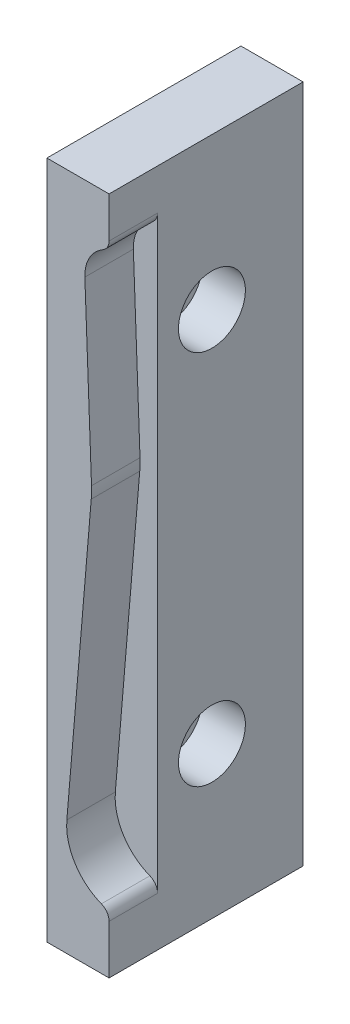
ISO-10303-21;
HEADER;
FILE_DESCRIPTION(('STEP AP214'),'2;1');
FILE_NAME('part.step','',(''),(''),'','','');
FILE_SCHEMA(('AUTOMOTIVE_DESIGN { 1 0 10303 214 1 1 1 1 }'));
ENDSEC;
DATA;
#1=APPLICATION_CONTEXT('core data for automotive mechanical design processes');
#2=APPLICATION_PROTOCOL_DEFINITION('international standard','automotive_design',2000,#1);
#3=PRODUCT_CONTEXT('',#1,'mechanical');
#4=PRODUCT('Part','Part','',(#3));
#5=PRODUCT_RELATED_PRODUCT_CATEGORY('part','',(#4));
#6=PRODUCT_DEFINITION_FORMATION('','',#4);
#7=PRODUCT_DEFINITION_CONTEXT('part definition',#1,'design');
#8=PRODUCT_DEFINITION('design','',#6,#7);
#9=PRODUCT_DEFINITION_SHAPE('','',#8);
#10=(LENGTH_UNIT() NAMED_UNIT(*) SI_UNIT(.MILLI.,.METRE.));
#11=(NAMED_UNIT(*) PLANE_ANGLE_UNIT() SI_UNIT($,.RADIAN.));
#12=(NAMED_UNIT(*) SI_UNIT($,.STERADIAN.) SOLID_ANGLE_UNIT());
#13=UNCERTAINTY_MEASURE_WITH_UNIT(LENGTH_MEASURE(1.E-05),#10,'distance_accuracy_value','');
#14=(GEOMETRIC_REPRESENTATION_CONTEXT(3) GLOBAL_UNCERTAINTY_ASSIGNED_CONTEXT((#13)) GLOBAL_UNIT_ASSIGNED_CONTEXT((#10,
#11,#12)) REPRESENTATION_CONTEXT('',''));
#15=CARTESIAN_POINT('',(0.,0.,0.));
#16=DIRECTION('',(0.,0.,1.));
#17=DIRECTION('',(1.,0.,0.));
#18=AXIS2_PLACEMENT_3D('',#15,#16,#17);
#19=CARTESIAN_POINT('',(-19.4563999999999,10.5685181210666,-20.574));
#20=DIRECTION('',(1.,0.,0.));
#21=DIRECTION('',(0.,1.,0.));
#22=AXIS2_PLACEMENT_3D('',#19,#20,#21);
#23=CYLINDRICAL_SURFACE('',#22,6.7437);
#24=CARTESIAN_POINT('',(-19.4563999999999,10.5685181210666,-20.574));
#25=DIRECTION('',(1.,0.,0.));
#26=DIRECTION('',(0.,1.,0.));
#27=AXIS2_PLACEMENT_3D('',#24,#25,#26);
#28=CIRCLE('',#27,6.7437);
#29=CARTESIAN_POINT('',(-19.4563999999999,17.3122181210666,-20.574));
#30=VERTEX_POINT('',#29);
#31=EDGE_CURVE('E165',#30,#30,#28,.T.);
#32=ORIENTED_EDGE('',*,*,#31,.F.);
#33=EDGE_LOOP('',(#32));
#34=FACE_BOUND('',#33,.T.);
#35=CARTESIAN_POINT('',(-14.5033999999999,10.5685181210666,-20.574));
#36=DIRECTION('',(1.,0.,0.));
#37=DIRECTION('',(0.,1.,0.));
#38=AXIS2_PLACEMENT_3D('',#35,#36,#37);
#39=CIRCLE('',#38,6.7437);
#40=CARTESIAN_POINT('',(-14.5033999999999,17.3122181210666,-20.574));
#41=VERTEX_POINT('',#40);
#42=EDGE_CURVE('E49',#41,#41,#39,.F.);
#43=ORIENTED_EDGE('',*,*,#42,.F.);
#44=EDGE_LOOP('',(#43));
#45=FACE_BOUND('',#44,.T.);
#46=ADVANCED_FACE('F45',(#34,#45),#23,.F.);
#47=CARTESIAN_POINT('',(-19.4564,108.991994121067,-20.574));
#48=DIRECTION('',(1.,0.,0.));
#49=DIRECTION('',(0.,1.,0.));
#50=AXIS2_PLACEMENT_3D('',#47,#48,#49);
#51=CYLINDRICAL_SURFACE('',#50,6.7437);
#52=CARTESIAN_POINT('',(-19.4564,108.991994121067,-20.574));
#53=DIRECTION('',(1.,0.,0.));
#54=DIRECTION('',(0.,1.,0.));
#55=AXIS2_PLACEMENT_3D('',#52,#53,#54);
#56=CIRCLE('',#55,6.7437);
#57=CARTESIAN_POINT('',(-19.4564,115.735694121067,-20.574));
#58=VERTEX_POINT('',#57);
#59=EDGE_CURVE('E162',#58,#58,#56,.T.);
#60=ORIENTED_EDGE('',*,*,#59,.F.);
#61=EDGE_LOOP('',(#60));
#62=FACE_BOUND('',#61,.T.);
#63=CARTESIAN_POINT('',(-14.5033999999999,108.991994121067,-20.574));
#64=DIRECTION('',(1.,0.,0.));
#65=DIRECTION('',(0.,1.,0.));
#66=AXIS2_PLACEMENT_3D('',#63,#64,#65);
#67=CIRCLE('',#66,6.7437);
#68=CARTESIAN_POINT('',(-14.5033999999999,115.735694121067,-20.574));
#69=VERTEX_POINT('',#68);
#70=EDGE_CURVE('E305',#69,#69,#67,.F.);
#71=ORIENTED_EDGE('',*,*,#70,.F.);
#72=EDGE_LOOP('',(#71));
#73=FACE_BOUND('',#72,.T.);
#74=ADVANCED_FACE('F335',(#62,#73),#51,.F.);
#75=CARTESIAN_POINT('',(0.,0.,6.35));
#76=DIRECTION('',(0.,0.,-1.));
#77=DIRECTION('',(-1.,0.,0.));
#78=AXIS2_PLACEMENT_3D('',#75,#76,#77);
#79=CYLINDRICAL_SURFACE('',#78,14.2875);
#80=CARTESIAN_POINT('',(0.,0.,6.35));
#81=DIRECTION('',(0.,0.,-1.));
#82=DIRECTION('',(1.,0.,0.));
#83=AXIS2_PLACEMENT_3D('',#80,#81,#82);
#84=CIRCLE('',#83,14.2875);
#85=CARTESIAN_POINT('',(-5.19545454545446,-13.3093917335134,6.35));
#86=VERTEX_POINT('',#85);
#87=CARTESIAN_POINT('',(-14.2371802911365,1.19806243897204,6.35));
#88=VERTEX_POINT('',#87);
#89=EDGE_CURVE('E172',#86,#88,#84,.T.);
#90=ORIENTED_EDGE('',*,*,#89,.F.);
#91=DIRECTION('',(0.,0.,-1.));
#92=VECTOR('',#91,1.);
#93=CARTESIAN_POINT('',(-5.19545454545446,-13.3093917335134,6.35));
#94=LINE('',#93,#92);
#95=CARTESIAN_POINT('',(-5.19545454545446,-13.3093917335134,-6.35));
#96=VERTEX_POINT('',#95);
#97=EDGE_CURVE('E54',#86,#96,#94,.T.);
#98=ORIENTED_EDGE('',*,*,#97,.T.);
#99=CARTESIAN_POINT('',(0.,0.,-6.35));
#100=DIRECTION('',(0.,0.,-1.));
#101=DIRECTION('',(1.,0.,0.));
#102=AXIS2_PLACEMENT_3D('',#99,#100,#101);
#103=CIRCLE('',#102,14.2875);
#104=CARTESIAN_POINT('',(-14.2371802911365,1.19806243897204,-6.35));
#105=VERTEX_POINT('',#104);
#106=EDGE_CURVE('E169',#96,#105,#103,.T.);
#107=ORIENTED_EDGE('',*,*,#106,.T.);
#108=DIRECTION('',(0.,0.,-1.));
#109=VECTOR('',#108,1.);
#110=CARTESIAN_POINT('',(-14.2371802911365,1.19806243897204,6.35));
#111=LINE('',#110,#109);
#112=EDGE_CURVE('E280',#88,#105,#111,.T.);
#113=ORIENTED_EDGE('',*,*,#112,.F.);
#114=EDGE_LOOP('',(#90,#98,#107,#113));
#115=FACE_BOUND('',#114,.T.);
#116=ADVANCED_FACE('F300',(#115),#79,.F.);
#117=CARTESIAN_POINT('',(-7.84751394995249,77.1296906583637,6.35));
#118=DIRECTION('',(-0.996478060621974,0.0838538889919186,0.));
#119=DIRECTION('',(-0.0838538889919186,-0.996478060621974,0.));
#120=AXIS2_PLACEMENT_3D('',#117,#118,#119);
#121=PLANE('',#120);
#122=DIRECTION('',(0.0838538889919186,0.996478060621974,0.));
#123=VECTOR('',#122,1.);
#124=CARTESIAN_POINT('',(-7.84751394995249,77.1296906583637,-6.35));
#125=LINE('',#124,#123);
#126=CARTESIAN_POINT('',(-7.84751394995249,77.1296906583637,-6.35));
#127=VERTEX_POINT('',#126);
#128=EDGE_CURVE('E194',#105,#127,#125,.T.);
#129=ORIENTED_EDGE('',*,*,#128,.T.);
#130=DIRECTION('',(0.,0.,-1.));
#131=VECTOR('',#130,1.);
#132=CARTESIAN_POINT('',(-7.84751394995249,77.1296906583637,6.35));
#133=LINE('',#132,#131);
#134=CARTESIAN_POINT('',(-7.84751394995249,77.1296906583637,6.35));
#135=VERTEX_POINT('',#134);
#136=EDGE_CURVE('E278',#135,#127,#133,.T.);
#137=ORIENTED_EDGE('',*,*,#136,.F.);
#138=DIRECTION('',(0.0838538889919186,0.996478060621974,0.));
#139=VECTOR('',#138,1.);
#140=CARTESIAN_POINT('',(-7.84751394995249,77.1296906583637,6.35));
#141=LINE('',#140,#139);
#142=EDGE_CURVE('E175',#88,#135,#141,.T.);
#143=ORIENTED_EDGE('',*,*,#142,.F.);
#144=ORIENTED_EDGE('',*,*,#112,.T.);
#145=EDGE_LOOP('',(#129,#137,#143,#144));
#146=FACE_BOUND('',#145,.T.);
#147=ADVANCED_FACE('F389',(#146),#121,.F.);
#148=CARTESIAN_POINT('',(-33.1580566897506,79.2595794387585,6.35));
#149=DIRECTION('',(0.,0.,-1.));
#150=DIRECTION('',(-1.,0.,0.));
#151=AXIS2_PLACEMENT_3D('',#148,#149,#150);
#152=CYLINDRICAL_SURFACE('',#151,25.4);
#153=CARTESIAN_POINT('',(-33.1580566897506,79.2595794387585,-6.35));
#154=DIRECTION('',(0.,0.,1.));
#155=DIRECTION('',(1.,0.,0.));
#156=AXIS2_PLACEMENT_3D('',#153,#154,#155);
#157=CIRCLE('',#156,25.4);
#158=CARTESIAN_POINT('',(-7.77592234785575,80.2120794387585,-6.35));
#159=VERTEX_POINT('',#158);
#160=EDGE_CURVE('E243',#127,#159,#157,.T.);
#161=ORIENTED_EDGE('',*,*,#160,.T.);
#162=DIRECTION('',(0.,0.,-1.));
#163=VECTOR('',#162,1.);
#164=CARTESIAN_POINT('',(-7.77592234785575,80.2120794387585,6.35));
#165=LINE('',#164,#163);
#166=CARTESIAN_POINT('',(-7.77592234785575,80.2120794387585,6.35));
#167=VERTEX_POINT('',#166);
#168=EDGE_CURVE('E275',#167,#159,#165,.T.);
#169=ORIENTED_EDGE('',*,*,#168,.F.);
#170=CARTESIAN_POINT('',(-33.1580566897506,79.2595794387585,6.35));
#171=DIRECTION('',(0.,0.,1.));
#172=DIRECTION('',(1.,0.,0.));
#173=AXIS2_PLACEMENT_3D('',#170,#171,#172);
#174=CIRCLE('',#173,25.4);
#175=EDGE_CURVE('E177',#135,#167,#174,.T.);
#176=ORIENTED_EDGE('',*,*,#175,.F.);
#177=ORIENTED_EDGE('',*,*,#136,.T.);
#178=EDGE_LOOP('',(#161,#169,#176,#177));
#179=FACE_BOUND('',#178,.T.);
#180=ADVANCED_FACE('F385',(#179),#152,.T.);
#181=CARTESIAN_POINT('',(-9.5183003782105,126.642812499997,6.35));
#182=DIRECTION('',(-0.999296627633657,-0.0375000000000004,0.));
#183=DIRECTION('',(0.0375000000000004,-0.999296627633657,0.));
#184=AXIS2_PLACEMENT_3D('',#181,#182,#183);
#185=PLANE('',#184);
#186=DIRECTION('',(-0.0375000000000004,0.999296627633657,0.));
#187=VECTOR('',#186,1.);
#188=CARTESIAN_POINT('',(-9.5183003782105,126.642812499997,-6.35));
#189=LINE('',#188,#187);
#190=CARTESIAN_POINT('',(-9.51830037821048,126.642812499997,-6.35));
#191=VERTEX_POINT('',#190);
#192=EDGE_CURVE('E239',#159,#191,#189,.T.);
#193=ORIENTED_EDGE('',*,*,#192,.T.);
#194=DIRECTION('',(0.,0.,-1.));
#195=VECTOR('',#194,1.);
#196=CARTESIAN_POINT('',(-9.51830037821048,126.642812499997,6.35));
#197=LINE('',#196,#195);
#198=CARTESIAN_POINT('',(-9.51830037821048,126.642812499997,6.35));
#199=VERTEX_POINT('',#198);
#200=EDGE_CURVE('E272',#199,#191,#197,.T.);
#201=ORIENTED_EDGE('',*,*,#200,.F.);
#202=DIRECTION('',(-0.0375000000000004,0.999296627633657,0.));
#203=VECTOR('',#202,1.);
#204=CARTESIAN_POINT('',(-9.5183003782105,126.642812499997,6.35));
#205=LINE('',#204,#203);
#206=EDGE_CURVE('E179',#167,#199,#205,.T.);
#207=ORIENTED_EDGE('',*,*,#206,.F.);
#208=ORIENTED_EDGE('',*,*,#168,.T.);
#209=EDGE_LOOP('',(#193,#201,#207,#208));
#210=FACE_BOUND('',#209,.T.);
#211=ADVANCED_FACE('F381',(#210),#185,.F.);
#212=CARTESIAN_POINT('',(0.,126.999999999997,6.35));
#213=DIRECTION('',(0.,0.,-1.));
#214=DIRECTION('',(-1.,0.,0.));
#215=AXIS2_PLACEMENT_3D('',#212,#213,#214);
#216=CYLINDRICAL_SURFACE('',#215,9.52499999999997);
#217=CARTESIAN_POINT('',(0.,126.999999999997,-6.35));
#218=DIRECTION('',(0.,0.,-1.));
#219=DIRECTION('',(-1.,0.,0.));
#220=AXIS2_PLACEMENT_3D('',#217,#218,#219);
#221=CIRCLE('',#220,9.52499999999997);
#222=CARTESIAN_POINT('',(-4.76249999999986,135.248891971044,-6.35));
#223=VERTEX_POINT('',#222);
#224=EDGE_CURVE('E173',#191,#223,#221,.T.);
#225=ORIENTED_EDGE('',*,*,#224,.T.);
#226=DIRECTION('',(0.,0.,-1.));
#227=VECTOR('',#226,1.);
#228=CARTESIAN_POINT('',(-4.76249999999986,135.248891971044,6.35));
#229=LINE('',#228,#227);
#230=CARTESIAN_POINT('',(-4.76249999999986,135.248891971044,6.35));
#231=VERTEX_POINT('',#230);
#232=EDGE_CURVE('E399',#223,#231,#229,.F.);
#233=ORIENTED_EDGE('',*,*,#232,.T.);
#234=CARTESIAN_POINT('',(0.,126.999999999997,6.35));
#235=DIRECTION('',(0.,0.,-1.));
#236=DIRECTION('',(-1.,0.,0.));
#237=AXIS2_PLACEMENT_3D('',#234,#235,#236);
#238=CIRCLE('',#237,9.52499999999997);
#239=EDGE_CURVE('E181',#199,#231,#238,.T.);
#240=ORIENTED_EDGE('',*,*,#239,.F.);
#241=ORIENTED_EDGE('',*,*,#200,.T.);
#242=EDGE_LOOP('',(#225,#233,#240,#241));
#243=FACE_BOUND('',#242,.T.);
#244=ADVANCED_FACE('F377',(#243),#216,.F.);
#245=CARTESIAN_POINT('',(-3.17499999999986,148.680256121067,6.35));
#246=DIRECTION('',(-1.,0.,0.));
#247=DIRECTION('',(0.,-1.,0.));
#248=AXIS2_PLACEMENT_3D('',#245,#246,#247);
#249=PLANE('',#248);
#250=CARTESIAN_POINT('',(-3.17499999999985,108.991994121067,-20.574));
#251=DIRECTION('',(1.,0.,0.));
#252=DIRECTION('',(0.,1.,0.));
#253=AXIS2_PLACEMENT_3D('',#250,#251,#252);
#254=CIRCLE('',#253,8.7641176);
#255=CARTESIAN_POINT('',(-3.17499999999985,117.756111721067,-20.574));
#256=VERTEX_POINT('',#255);
#257=EDGE_CURVE('E312',#256,#256,#254,.T.);
#258=ORIENTED_EDGE('',*,*,#257,.F.);
#259=EDGE_LOOP('',(#258));
#260=FACE_BOUND('',#259,.T.);
#261=CARTESIAN_POINT('',(-3.17499999999982,10.5685181210666,-20.574));
#262=DIRECTION('',(1.,0.,0.));
#263=DIRECTION('',(0.,1.,0.));
#264=AXIS2_PLACEMENT_3D('',#261,#262,#263);
#265=CIRCLE('',#264,8.7641176);
#266=CARTESIAN_POINT('',(-3.17499999999982,19.3326357210666,-20.574));
#267=VERTEX_POINT('',#266);
#268=EDGE_CURVE('E320',#267,#267,#265,.T.);
#269=ORIENTED_EDGE('',*,*,#268,.F.);
#270=EDGE_LOOP('',(#269));
#271=FACE_BOUND('',#270,.T.);
#272=DIRECTION('',(0.,1.,0.));
#273=VECTOR('',#272,1.);
#274=CARTESIAN_POINT('',(-3.17499999999986,148.680256121067,6.35));
#275=LINE('',#274,#273);
#276=CARTESIAN_POINT('',(-3.17499999999985,137.99852262806,6.35));
#277=VERTEX_POINT('',#276);
#278=CARTESIAN_POINT('',(-3.17499999999986,148.680256121067,6.35));
#279=VERTEX_POINT('',#278);
#280=EDGE_CURVE('E184',#277,#279,#275,.T.);
#281=ORIENTED_EDGE('',*,*,#280,.F.);
#282=DIRECTION('',(0.,0.,-1.));
#283=VECTOR('',#282,1.);
#284=CARTESIAN_POINT('',(-3.17499999999985,137.99852262806,6.35));
#285=LINE('',#284,#283);
#286=CARTESIAN_POINT('',(-3.17499999999985,137.99852262806,-6.35));
#287=VERTEX_POINT('',#286);
#288=EDGE_CURVE('E225',#277,#287,#285,.T.);
#289=ORIENTED_EDGE('',*,*,#288,.T.);
#290=DIRECTION('',(0.,-1.,0.));
#291=VECTOR('',#290,1.);
#292=CARTESIAN_POINT('',(-3.17499999999986,148.680256121067,-6.35));
#293=LINE('',#292,#291);
#294=CARTESIAN_POINT('',(-3.17499999999986,-16.2670343409609,-6.35));
#295=VERTEX_POINT('',#294);
#296=EDGE_CURVE('E160',#287,#295,#293,.T.);
#297=ORIENTED_EDGE('',*,*,#296,.T.);
#298=DIRECTION('',(0.,0.,-1.));
#299=VECTOR('',#298,1.);
#300=CARTESIAN_POINT('',(-3.17499999999989,-16.2670343409609,6.35));
#301=LINE('',#300,#299);
#302=CARTESIAN_POINT('',(-3.17499999999989,-16.2670343409609,6.35));
#303=VERTEX_POINT('',#302);
#304=EDGE_CURVE('E13',#295,#303,#301,.F.);
#305=ORIENTED_EDGE('',*,*,#304,.T.);
#306=DIRECTION('',(0.,1.,0.));
#307=VECTOR('',#306,1.);
#308=CARTESIAN_POINT('',(-3.1749999999999,-13.930255964985,6.35));
#309=LINE('',#308,#307);
#310=CARTESIAN_POINT('',(-3.17499999999984,-29.1197438789334,6.35));
#311=VERTEX_POINT('',#310);
#312=EDGE_CURVE('E141',#311,#303,#309,.T.);
#313=ORIENTED_EDGE('',*,*,#312,.F.);
#314=DIRECTION('',(0.,0.,-1.));
#315=VECTOR('',#314,1.);
#316=CARTESIAN_POINT('',(-3.17499999999984,-29.1197438789334,6.35));
#317=LINE('',#316,#315);
#318=CARTESIAN_POINT('',(-3.17499999999986,-29.1197438789334,-44.45));
#319=VERTEX_POINT('',#318);
#320=EDGE_CURVE('E134',#311,#319,#317,.T.);
#321=ORIENTED_EDGE('',*,*,#320,.T.);
#322=DIRECTION('',(0.,-1.,0.));
#323=VECTOR('',#322,1.);
#324=CARTESIAN_POINT('',(-3.17499999999986,148.680256121067,-44.45));
#325=LINE('',#324,#323);
#326=CARTESIAN_POINT('',(-3.17499999999986,148.680256121067,-44.45));
#327=VERTEX_POINT('',#326);
#328=EDGE_CURVE('E140',#327,#319,#325,.T.);
#329=ORIENTED_EDGE('',*,*,#328,.F.);
#330=DIRECTION('',(0.,0.,-1.));
#331=VECTOR('',#330,1.);
#332=CARTESIAN_POINT('',(-3.17499999999986,148.680256121067,6.35));
#333=LINE('',#332,#331);
#334=EDGE_CURVE('E270',#279,#327,#333,.T.);
#335=ORIENTED_EDGE('',*,*,#334,.F.);
#336=EDGE_LOOP('',(#281,#289,#297,#305,#313,#321,#329,#335));
#337=FACE_BOUND('',#336,.T.);
#338=ADVANCED_FACE('F137',(#260,#271,#337),#249,.F.);
#339=CARTESIAN_POINT('',(-3.17499999999986,148.680256121067,6.35));
#340=DIRECTION('',(0.,-1.,0.));
#341=DIRECTION('',(1.,0.,0.));
#342=AXIS2_PLACEMENT_3D('',#339,#340,#341);
#343=PLANE('',#342);
#344=ORIENTED_EDGE('',*,*,#334,.T.);
#345=DIRECTION('',(1.,0.,0.));
#346=VECTOR('',#345,1.);
#347=CARTESIAN_POINT('',(-3.17499999999986,148.680256121067,-44.45));
#348=LINE('',#347,#346);
#349=CARTESIAN_POINT('',(-19.4563999999999,148.680256121067,-44.45));
#350=VERTEX_POINT('',#349);
#351=EDGE_CURVE('E159',#350,#327,#348,.T.);
#352=ORIENTED_EDGE('',*,*,#351,.F.);
#353=DIRECTION('',(0.,0.,-1.));
#354=VECTOR('',#353,1.);
#355=CARTESIAN_POINT('',(-19.4563999999999,148.680256121067,6.35));
#356=LINE('',#355,#354);
#357=CARTESIAN_POINT('',(-19.4563999999999,148.680256121067,6.35));
#358=VERTEX_POINT('',#357);
#359=EDGE_CURVE('E268',#358,#350,#356,.T.);
#360=ORIENTED_EDGE('',*,*,#359,.F.);
#361=DIRECTION('',(-1.,0.,0.));
#362=VECTOR('',#361,1.);
#363=CARTESIAN_POINT('',(-3.17499999999986,148.680256121067,6.35));
#364=LINE('',#363,#362);
#365=EDGE_CURVE('E186',#279,#358,#364,.T.);
#366=ORIENTED_EDGE('',*,*,#365,.F.);
#367=EDGE_LOOP('',(#344,#352,#360,#366));
#368=FACE_BOUND('',#367,.T.);
#369=ADVANCED_FACE('F371',(#368),#343,.F.);
#370=CARTESIAN_POINT('',(-19.4563999999999,148.680256121067,6.35));
#371=DIRECTION('',(1.,0.,0.));
#372=DIRECTION('',(0.,1.,0.));
#373=AXIS2_PLACEMENT_3D('',#370,#371,#372);
#374=PLANE('',#373);
#375=ORIENTED_EDGE('',*,*,#59,.T.);
#376=EDGE_LOOP('',(#375));
#377=FACE_BOUND('',#376,.T.);
#378=ORIENTED_EDGE('',*,*,#31,.T.);
#379=EDGE_LOOP('',(#378));
#380=FACE_BOUND('',#379,.T.);
#381=ORIENTED_EDGE('',*,*,#359,.T.);
#382=DIRECTION('',(0.,1.,0.));
#383=VECTOR('',#382,1.);
#384=CARTESIAN_POINT('',(-19.4563999999999,148.680256121067,-44.45));
#385=LINE('',#384,#383);
#386=CARTESIAN_POINT('',(-19.4563999999999,-29.1197438789334,-44.45));
#387=VERTEX_POINT('',#386);
#388=EDGE_CURVE('E154',#387,#350,#385,.T.);
#389=ORIENTED_EDGE('',*,*,#388,.F.);
#390=DIRECTION('',(0.,0.,-1.));
#391=VECTOR('',#390,1.);
#392=CARTESIAN_POINT('',(-19.4563999999999,-29.1197438789334,6.35));
#393=LINE('',#392,#391);
#394=CARTESIAN_POINT('',(-19.4563999999999,-29.1197438789334,6.35));
#395=VERTEX_POINT('',#394);
#396=EDGE_CURVE('E144',#395,#387,#393,.T.);
#397=ORIENTED_EDGE('',*,*,#396,.F.);
#398=DIRECTION('',(0.,-1.,0.));
#399=VECTOR('',#398,1.);
#400=CARTESIAN_POINT('',(-19.4563999999999,148.680256121067,6.35));
#401=LINE('',#400,#399);
#402=EDGE_CURVE('E188',#358,#395,#401,.T.);
#403=ORIENTED_EDGE('',*,*,#402,.F.);
#404=EDGE_LOOP('',(#381,#389,#397,#403));
#405=FACE_BOUND('',#404,.T.);
#406=ADVANCED_FACE('F330',(#377,#380,#405),#374,.F.);
#407=CARTESIAN_POINT('',(-19.4563999999999,-29.1197438789334,6.35));
#408=DIRECTION('',(0.,1.,0.));
#409=DIRECTION('',(0.,0.,1.));
#410=AXIS2_PLACEMENT_3D('',#407,#408,#409);
#411=PLANE('',#410);
#412=ORIENTED_EDGE('',*,*,#396,.T.);
#413=DIRECTION('',(-1.,0.,0.));
#414=VECTOR('',#413,1.);
#415=CARTESIAN_POINT('',(-3.17499999999986,-29.1197438789334,-44.45));
#416=LINE('',#415,#414);
#417=EDGE_CURVE('E148',#319,#387,#416,.T.);
#418=ORIENTED_EDGE('',*,*,#417,.F.);
#419=ORIENTED_EDGE('',*,*,#320,.F.);
#420=DIRECTION('',(1.,0.,0.));
#421=VECTOR('',#420,1.);
#422=CARTESIAN_POINT('',(-19.4563999999999,-29.1197438789334,6.35));
#423=LINE('',#422,#421);
#424=EDGE_CURVE('E145',#395,#311,#423,.T.);
#425=ORIENTED_EDGE('',*,*,#424,.F.);
#426=EDGE_LOOP('',(#412,#418,#419,#425));
#427=FACE_BOUND('',#426,.T.);
#428=ADVANCED_FACE('F149',(#427),#411,.F.);
#429=CARTESIAN_POINT('',(0.,126.999999999997,6.35));
#430=DIRECTION('',(0.,0.,-1.));
#431=DIRECTION('',(-1.,0.,0.));
#432=AXIS2_PLACEMENT_3D('',#429,#430,#431);
#433=PLANE('',#432);
#434=ORIENTED_EDGE('',*,*,#239,.T.);
#435=CARTESIAN_POINT('',(-6.34999999999985,137.99852262806,6.35));
#436=DIRECTION('',(0.,0.,-1.));
#437=DIRECTION('',(-1.,0.,0.));
#438=AXIS2_PLACEMENT_3D('',#435,#436,#437);
#439=CIRCLE('',#438,3.175);
#440=EDGE_CURVE('E301',#231,#277,#439,.F.);
#441=ORIENTED_EDGE('',*,*,#440,.T.);
#442=ORIENTED_EDGE('',*,*,#280,.T.);
#443=ORIENTED_EDGE('',*,*,#365,.T.);
#444=ORIENTED_EDGE('',*,*,#402,.T.);
#445=ORIENTED_EDGE('',*,*,#424,.T.);
#446=ORIENTED_EDGE('',*,*,#312,.T.);
#447=CARTESIAN_POINT('',(-6.34999999999989,-16.2670343409609,6.35));
#448=DIRECTION('',(0.,0.,-1.));
#449=DIRECTION('',(-1.,0.,0.));
#450=AXIS2_PLACEMENT_3D('',#447,#448,#449);
#451=CIRCLE('',#450,3.175);
#452=EDGE_CURVE('E62',#303,#86,#451,.F.);
#453=ORIENTED_EDGE('',*,*,#452,.T.);
#454=ORIENTED_EDGE('',*,*,#89,.T.);
#455=ORIENTED_EDGE('',*,*,#142,.T.);
#456=ORIENTED_EDGE('',*,*,#175,.T.);
#457=ORIENTED_EDGE('',*,*,#206,.T.);
#458=EDGE_LOOP('',(#434,#441,#442,#443,#444,#445,#446,#453,#454,#455,#456,#457));
#459=FACE_BOUND('',#458,.T.);
#460=ADVANCED_FACE('F363',(#459),#433,.F.);
#461=CARTESIAN_POINT('',(-6.34999999999985,137.99852262806,6.35));
#462=DIRECTION('',(0.,0.,-1.));
#463=DIRECTION('',(-1.,0.,0.));
#464=AXIS2_PLACEMENT_3D('',#461,#462,#463);
#465=CYLINDRICAL_SURFACE('',#464,3.175);
#466=ORIENTED_EDGE('',*,*,#440,.F.);
#467=ORIENTED_EDGE('',*,*,#232,.F.);
#468=CARTESIAN_POINT('',(-6.34999999999985,137.99852262806,-6.35));
#469=DIRECTION('',(0.,0.,-1.));
#470=DIRECTION('',(-1.,0.,0.));
#471=AXIS2_PLACEMENT_3D('',#468,#469,#470);
#472=CIRCLE('',#471,3.175);
#473=EDGE_CURVE('E224',#287,#223,#472,.T.);
#474=ORIENTED_EDGE('',*,*,#473,.F.);
#475=ORIENTED_EDGE('',*,*,#288,.F.);
#476=EDGE_LOOP('',(#466,#467,#474,#475));
#477=FACE_BOUND('',#476,.T.);
#478=ADVANCED_FACE('F366',(#477),#465,.T.);
#479=CARTESIAN_POINT('',(-6.34999999999989,-16.2670343409609,6.35));
#480=DIRECTION('',(0.,0.,-1.));
#481=DIRECTION('',(-1.,0.,0.));
#482=AXIS2_PLACEMENT_3D('',#479,#480,#481);
#483=CYLINDRICAL_SURFACE('',#482,3.175);
#484=ORIENTED_EDGE('',*,*,#452,.F.);
#485=ORIENTED_EDGE('',*,*,#304,.F.);
#486=CARTESIAN_POINT('',(-6.34999999999989,-16.2670343409609,-6.35));
#487=DIRECTION('',(0.,0.,-1.));
#488=DIRECTION('',(-1.,0.,0.));
#489=AXIS2_PLACEMENT_3D('',#486,#487,#488);
#490=CIRCLE('',#489,3.175);
#491=EDGE_CURVE('E219',#96,#295,#490,.T.);
#492=ORIENTED_EDGE('',*,*,#491,.F.);
#493=ORIENTED_EDGE('',*,*,#97,.F.);
#494=EDGE_LOOP('',(#484,#485,#492,#493));
#495=FACE_BOUND('',#494,.T.);
#496=ADVANCED_FACE('F47',(#495),#483,.T.);
#497=CARTESIAN_POINT('',(0.,0.,-44.45));
#498=DIRECTION('',(0.,0.,-1.));
#499=DIRECTION('',(-1.,0.,0.));
#500=AXIS2_PLACEMENT_3D('',#497,#498,#499);
#501=PLANE('',#500);
#502=ORIENTED_EDGE('',*,*,#328,.T.);
#503=ORIENTED_EDGE('',*,*,#417,.T.);
#504=ORIENTED_EDGE('',*,*,#388,.T.);
#505=ORIENTED_EDGE('',*,*,#351,.T.);
#506=EDGE_LOOP('',(#502,#503,#504,#505));
#507=FACE_BOUND('',#506,.T.);
#508=ADVANCED_FACE('F157',(#507),#501,.T.);
#509=CARTESIAN_POINT('',(0.,0.,-6.35));
#510=DIRECTION('',(0.,0.,-1.));
#511=DIRECTION('',(-1.,0.,0.));
#512=AXIS2_PLACEMENT_3D('',#509,#510,#511);
#513=PLANE('',#512);
#514=ORIENTED_EDGE('',*,*,#296,.F.);
#515=ORIENTED_EDGE('',*,*,#473,.T.);
#516=ORIENTED_EDGE('',*,*,#224,.F.);
#517=ORIENTED_EDGE('',*,*,#192,.F.);
#518=ORIENTED_EDGE('',*,*,#160,.F.);
#519=ORIENTED_EDGE('',*,*,#128,.F.);
#520=ORIENTED_EDGE('',*,*,#106,.F.);
#521=ORIENTED_EDGE('',*,*,#491,.T.);
#522=EDGE_LOOP('',(#514,#515,#516,#517,#518,#519,#520,#521));
#523=FACE_BOUND('',#522,.T.);
#524=ADVANCED_FACE('F293',(#523),#513,.F.);
#525=CARTESIAN_POINT('',(-14.5033999999999,148.680256121067,6.35));
#526=DIRECTION('',(1.,0.,0.));
#527=DIRECTION('',(0.,1.,0.));
#528=AXIS2_PLACEMENT_3D('',#525,#526,#527);
#529=PLANE('',#528);
#530=CARTESIAN_POINT('',(-14.5033999999999,108.991994121067,-20.574));
#531=DIRECTION('',(1.,0.,0.));
#532=DIRECTION('',(0.,1.,0.));
#533=AXIS2_PLACEMENT_3D('',#530,#531,#532);
#534=CIRCLE('',#533,8.7641176);
#535=CARTESIAN_POINT('',(-14.5033999999999,117.756111721067,-20.574));
#536=VERTEX_POINT('',#535);
#537=EDGE_CURVE('E307',#536,#536,#534,.F.);
#538=ORIENTED_EDGE('',*,*,#537,.F.);
#539=EDGE_LOOP('',(#538));
#540=FACE_BOUND('',#539,.T.);
#541=ORIENTED_EDGE('',*,*,#70,.T.);
#542=EDGE_LOOP('',(#541));
#543=FACE_BOUND('',#542,.T.);
#544=ADVANCED_FACE('F351',(#540,#543),#529,.T.);
#545=CARTESIAN_POINT('',(-44.2450679443054,108.991994121067,-20.574));
#546=DIRECTION('',(1.,0.,0.));
#547=DIRECTION('',(0.,1.,0.));
#548=AXIS2_PLACEMENT_3D('',#545,#546,#547);
#549=CYLINDRICAL_SURFACE('',#548,8.7641176);
#550=CARTESIAN_POINT('',(-14.5033999999999,117.756111721067,-20.574));
#551=CARTESIAN_POINT('',(-14.3853958333333,117.756111721067,-20.574));
#552=CARTESIAN_POINT('',(-14.2673916666666,117.756111721067,-20.574));
#553=CARTESIAN_POINT('',(-14.0313833333333,117.756111721067,-20.574));
#554=CARTESIAN_POINT('',(-13.9133791666666,117.756111721067,-20.574));
#555=CARTESIAN_POINT('',(-13.6773708333333,117.756111721067,-20.574));
#556=CARTESIAN_POINT('',(-13.5593666666666,117.756111721067,-20.574));
#557=CARTESIAN_POINT('',(-13.3233583333333,117.756111721067,-20.574));
#558=CARTESIAN_POINT('',(-13.2053541666666,117.756111721067,-20.574));
#559=CARTESIAN_POINT('',(-12.9693458333333,117.756111721067,-20.574));
#560=CARTESIAN_POINT('',(-12.8513416666666,117.756111721067,-20.574));
#561=CARTESIAN_POINT('',(-12.6153333333333,117.756111721067,-20.574));
#562=CARTESIAN_POINT('',(-12.4973291666666,117.756111721067,-20.574));
#563=CARTESIAN_POINT('',(-12.2613208333332,117.756111721067,-20.574));
#564=CARTESIAN_POINT('',(-12.1433166666666,117.756111721067,-20.574));
#565=CARTESIAN_POINT('',(-11.9073083333332,117.756111721067,-20.574));
#566=CARTESIAN_POINT('',(-11.7893041666666,117.756111721067,-20.574));
#567=CARTESIAN_POINT('',(-11.5532958333332,117.756111721067,-20.574));
#568=CARTESIAN_POINT('',(-11.4352916666666,117.756111721067,-20.574));
#569=CARTESIAN_POINT('',(-11.1992833333332,117.756111721067,-20.574));
#570=CARTESIAN_POINT('',(-11.0812791666666,117.756111721067,-20.574));
#571=CARTESIAN_POINT('',(-10.8452708333332,117.756111721067,-20.574));
#572=CARTESIAN_POINT('',(-10.7272666666666,117.756111721067,-20.574));
#573=CARTESIAN_POINT('',(-10.4912583333332,117.756111721067,-20.574));
#574=CARTESIAN_POINT('',(-10.3732541666666,117.756111721067,-20.574));
#575=CARTESIAN_POINT('',(-10.1372458333332,117.756111721067,-20.574));
#576=CARTESIAN_POINT('',(-10.0192416666666,117.756111721067,-20.574));
#577=CARTESIAN_POINT('',(-9.78323333333323,117.756111721067,-20.574));
#578=CARTESIAN_POINT('',(-9.66522916666656,117.756111721067,-20.574));
#579=CARTESIAN_POINT('',(-9.42922083333323,117.756111721067,-20.574));
#580=CARTESIAN_POINT('',(-9.31121666666656,117.756111721067,-20.574));
#581=CARTESIAN_POINT('',(-9.07520833333323,117.756111721067,-20.574));
#582=CARTESIAN_POINT('',(-8.95720416666656,117.756111721067,-20.574));
#583=CARTESIAN_POINT('',(-8.72119583333322,117.756111721067,-20.574));
#584=CARTESIAN_POINT('',(-8.60319166666655,117.756111721067,-20.574));
#585=CARTESIAN_POINT('',(-8.36718333333322,117.756111721067,-20.574));
#586=CARTESIAN_POINT('',(-8.24917916666655,117.756111721067,-20.574));
#587=CARTESIAN_POINT('',(-8.01317083333322,117.756111721067,-20.574));
#588=CARTESIAN_POINT('',(-7.89516666666655,117.756111721067,-20.574));
#589=CARTESIAN_POINT('',(-7.65915833333322,117.756111721067,-20.574));
#590=CARTESIAN_POINT('',(-7.54115416666655,117.756111721067,-20.574));
#591=CARTESIAN_POINT('',(-7.30514583333321,117.756111721067,-20.574));
#592=CARTESIAN_POINT('',(-7.18714166666654,117.756111721067,-20.574));
#593=CARTESIAN_POINT('',(-6.95113333333321,117.756111721067,-20.574));
#594=CARTESIAN_POINT('',(-6.83312916666654,117.756111721067,-20.574));
#595=CARTESIAN_POINT('',(-6.59712083333321,117.756111721067,-20.574));
#596=CARTESIAN_POINT('',(-6.47911666666654,117.756111721067,-20.574));
#597=CARTESIAN_POINT('',(-6.2431083333332,117.756111721067,-20.574));
#598=CARTESIAN_POINT('',(-6.12510416666654,117.756111721067,-20.574));
#599=CARTESIAN_POINT('',(-5.8890958333332,117.756111721067,-20.574));
#600=CARTESIAN_POINT('',(-5.77109166666654,117.756111721067,-20.574));
#601=CARTESIAN_POINT('',(-5.5350833333332,117.756111721067,-20.574));
#602=CARTESIAN_POINT('',(-5.41707916666654,117.756111721067,-20.574));
#603=CARTESIAN_POINT('',(-5.1810708333332,117.756111721067,-20.574));
#604=CARTESIAN_POINT('',(-5.06306666666654,117.756111721067,-20.574));
#605=CARTESIAN_POINT('',(-4.8270583333332,117.756111721067,-20.574));
#606=CARTESIAN_POINT('',(-4.70905416666653,117.756111721067,-20.574));
#607=CARTESIAN_POINT('',(-4.47304583333319,117.756111721067,-20.574));
#608=CARTESIAN_POINT('',(-4.35504166666653,117.756111721067,-20.574));
#609=CARTESIAN_POINT('',(-4.11903333333319,117.756111721067,-20.574));
#610=CARTESIAN_POINT('',(-4.00102916666652,117.756111721067,-20.574));
#611=CARTESIAN_POINT('',(-3.76502083333319,117.756111721067,-20.574));
#612=CARTESIAN_POINT('',(-3.64701666666652,117.756111721067,-20.574));
#613=CARTESIAN_POINT('',(-3.41100833333319,117.756111721067,-20.574));
#614=CARTESIAN_POINT('',(-3.29300416666652,117.756111721067,-20.574));
#615=CARTESIAN_POINT('',(-3.17499999999985,117.756111721067,-20.574));
#616=B_SPLINE_CURVE_WITH_KNOTS('',3,(#550,#551,#552,#553,#554,#555,#556,#557,#558,#559,#560,
#561,#562,#563,#564,#565,#566,#567,#568,#569,#570,#571,#572,#573,#574,#575,#576,#577,#578,#579,
#580,#581,#582,#583,#584,#585,#586,#587,#588,#589,#590,#591,#592,#593,#594,#595,#596,#597,#598,
#599,#600,#601,#602,#603,#604,#605,#606,#607,#608,#609,#610,#611,#612,#613,#614,#615),
.UNSPECIFIED.,.F.,.F.,(4,2,2,2,2,2,2,2,2,2,2,2,2,2,2,2,2,2,2,2,2,2,2,2,2,2,2,2,2,2,2,2,4),(0.,
0.354012500000004,0.708025000000004,1.06203750000001,1.41605000000001,1.77006250000001,
2.12407500000001,2.47808750000001,2.83210000000001,3.18611250000002,3.54012500000002,
3.89413750000002,4.24815000000002,4.60216250000003,4.95617500000003,5.31018750000003,
5.66420000000004,6.01821250000004,6.37222500000004,6.72623750000004,7.08025000000005,
7.43426250000005,7.78827500000005,8.14228750000006,8.49630000000006,8.85031250000006,
9.20432500000006,9.55833750000006,9.91235000000007,10.2663625000001,10.6203750000001,
10.9743875000001,11.3284000000001),.UNSPECIFIED.);
#617=EDGE_CURVE('BSEAM342',#536,#256,#616,.T.);
#618=ORIENTED_EDGE('',*,*,#537,.T.);
#619=ORIENTED_EDGE('',*,*,#257,.T.);
#620=ORIENTED_EDGE('',*,*,#617,.T.);
#621=ORIENTED_EDGE('',*,*,#617,.F.);
#622=EDGE_LOOP('',(#618,#620,#619,#621));
#623=FACE_BOUND('',#622,.T.);
#624=ADVANCED_FACE('F342',(#623),#549,.F.);
#625=CARTESIAN_POINT('',(-14.5033999999999,148.680256121067,6.35));
#626=DIRECTION('',(1.,0.,0.));
#627=DIRECTION('',(0.,1.,0.));
#628=AXIS2_PLACEMENT_3D('',#625,#626,#627);
#629=PLANE('',#628);
#630=CARTESIAN_POINT('',(-14.5033999999999,10.5685181210666,-20.574));
#631=DIRECTION('',(1.,0.,0.));
#632=DIRECTION('',(0.,1.,0.));
#633=AXIS2_PLACEMENT_3D('',#630,#631,#632);
#634=CIRCLE('',#633,8.7641176);
#635=CARTESIAN_POINT('',(-14.5033999999999,19.3326357210666,-20.574));
#636=VERTEX_POINT('',#635);
#637=EDGE_CURVE('E317',#636,#636,#634,.F.);
#638=ORIENTED_EDGE('',*,*,#637,.F.);
#639=EDGE_LOOP('',(#638));
#640=FACE_BOUND('',#639,.T.);
#641=ORIENTED_EDGE('',*,*,#42,.T.);
#642=EDGE_LOOP('',(#641));
#643=FACE_BOUND('',#642,.T.);
#644=ADVANCED_FACE('F339',(#640,#643),#629,.T.);
#645=CARTESIAN_POINT('',(-44.2450679443054,10.5685181210666,-20.574));
#646=DIRECTION('',(1.,0.,0.));
#647=DIRECTION('',(0.,1.,0.));
#648=AXIS2_PLACEMENT_3D('',#645,#646,#647);
#649=CYLINDRICAL_SURFACE('',#648,8.7641176);
#650=CARTESIAN_POINT('',(-14.5033999999999,19.3326357210666,-20.574));
#651=CARTESIAN_POINT('',(-14.3853958333332,19.3326357210666,-20.574));
#652=CARTESIAN_POINT('',(-14.2673916666666,19.3326357210666,-20.574));
#653=CARTESIAN_POINT('',(-14.0313833333332,19.3326357210666,-20.574));
#654=CARTESIAN_POINT('',(-13.9133791666666,19.3326357210666,-20.574));
#655=CARTESIAN_POINT('',(-13.6773708333332,19.3326357210666,-20.574));
#656=CARTESIAN_POINT('',(-13.5593666666666,19.3326357210666,-20.574));
#657=CARTESIAN_POINT('',(-13.3233583333332,19.3326357210666,-20.574));
#658=CARTESIAN_POINT('',(-13.2053541666666,19.3326357210666,-20.574));
#659=CARTESIAN_POINT('',(-12.9693458333332,19.3326357210666,-20.574));
#660=CARTESIAN_POINT('',(-12.8513416666666,19.3326357210666,-20.574));
#661=CARTESIAN_POINT('',(-12.6153333333332,19.3326357210666,-20.574));
#662=CARTESIAN_POINT('',(-12.4973291666666,19.3326357210666,-20.574));
#663=CARTESIAN_POINT('',(-12.2613208333332,19.3326357210666,-20.574));
#664=CARTESIAN_POINT('',(-12.1433166666666,19.3326357210666,-20.574));
#665=CARTESIAN_POINT('',(-11.9073083333332,19.3326357210666,-20.574));
#666=CARTESIAN_POINT('',(-11.7893041666666,19.3326357210666,-20.574));
#667=CARTESIAN_POINT('',(-11.5532958333332,19.3326357210666,-20.574));
#668=CARTESIAN_POINT('',(-11.4352916666666,19.3326357210666,-20.574));
#669=CARTESIAN_POINT('',(-11.1992833333332,19.3326357210666,-20.574));
#670=CARTESIAN_POINT('',(-11.0812791666666,19.3326357210666,-20.574));
#671=CARTESIAN_POINT('',(-10.8452708333332,19.3326357210666,-20.574));
#672=CARTESIAN_POINT('',(-10.7272666666666,19.3326357210666,-20.574));
#673=CARTESIAN_POINT('',(-10.4912583333332,19.3326357210666,-20.574));
#674=CARTESIAN_POINT('',(-10.3732541666665,19.3326357210666,-20.574));
#675=CARTESIAN_POINT('',(-10.1372458333332,19.3326357210666,-20.574));
#676=CARTESIAN_POINT('',(-10.0192416666665,19.3326357210666,-20.574));
#677=CARTESIAN_POINT('',(-9.78323333333321,19.3326357210666,-20.574));
#678=CARTESIAN_POINT('',(-9.66522916666654,19.3326357210666,-20.574));
#679=CARTESIAN_POINT('',(-9.42922083333321,19.3326357210666,-20.574));
#680=CARTESIAN_POINT('',(-9.31121666666654,19.3326357210666,-20.574));
#681=CARTESIAN_POINT('',(-9.07520833333321,19.3326357210666,-20.574));
#682=CARTESIAN_POINT('',(-8.95720416666654,19.3326357210666,-20.574));
#683=CARTESIAN_POINT('',(-8.7211958333332,19.3326357210666,-20.574));
#684=CARTESIAN_POINT('',(-8.60319166666654,19.3326357210666,-20.574));
#685=CARTESIAN_POINT('',(-8.3671833333332,19.3326357210666,-20.574));
#686=CARTESIAN_POINT('',(-8.24917916666653,19.3326357210666,-20.574));
#687=CARTESIAN_POINT('',(-8.0131708333332,19.3326357210666,-20.574));
#688=CARTESIAN_POINT('',(-7.89516666666653,19.3326357210666,-20.574));
#689=CARTESIAN_POINT('',(-7.65915833333319,19.3326357210666,-20.574));
#690=CARTESIAN_POINT('',(-7.54115416666652,19.3326357210666,-20.574));
#691=CARTESIAN_POINT('',(-7.30514583333319,19.3326357210666,-20.574));
#692=CARTESIAN_POINT('',(-7.18714166666652,19.3326357210666,-20.574));
#693=CARTESIAN_POINT('',(-6.95113333333319,19.3326357210666,-20.574));
#694=CARTESIAN_POINT('',(-6.83312916666652,19.3326357210666,-20.574));
#695=CARTESIAN_POINT('',(-6.59712083333319,19.3326357210666,-20.574));
#696=CARTESIAN_POINT('',(-6.47911666666652,19.3326357210666,-20.574));
#697=CARTESIAN_POINT('',(-6.24310833333318,19.3326357210666,-20.574));
#698=CARTESIAN_POINT('',(-6.12510416666652,19.3326357210666,-20.574));
#699=CARTESIAN_POINT('',(-5.88909583333318,19.3326357210666,-20.574));
#700=CARTESIAN_POINT('',(-5.77109166666651,19.3326357210666,-20.574));
#701=CARTESIAN_POINT('',(-5.53508333333317,19.3326357210666,-20.574));
#702=CARTESIAN_POINT('',(-5.41707916666651,19.3326357210666,-20.574));
#703=CARTESIAN_POINT('',(-5.18107083333317,19.3326357210666,-20.574));
#704=CARTESIAN_POINT('',(-5.06306666666651,19.3326357210666,-20.574));
#705=CARTESIAN_POINT('',(-4.82705833333317,19.3326357210666,-20.574));
#706=CARTESIAN_POINT('',(-4.70905416666651,19.3326357210666,-20.574));
#707=CARTESIAN_POINT('',(-4.47304583333317,19.3326357210666,-20.574));
#708=CARTESIAN_POINT('',(-4.3550416666665,19.3326357210666,-20.574));
#709=CARTESIAN_POINT('',(-4.11903333333317,19.3326357210666,-20.574));
#710=CARTESIAN_POINT('',(-4.0010291666665,19.3326357210666,-20.574));
#711=CARTESIAN_POINT('',(-3.76502083333316,19.3326357210666,-20.574));
#712=CARTESIAN_POINT('',(-3.64701666666649,19.3326357210666,-20.574));
#713=CARTESIAN_POINT('',(-3.41100833333316,19.3326357210666,-20.574));
#714=CARTESIAN_POINT('',(-3.29300416666649,19.3326357210666,-20.574));
#715=CARTESIAN_POINT('',(-3.17499999999982,19.3326357210666,-20.574));
#716=B_SPLINE_CURVE_WITH_KNOTS('',3,(#650,#651,#652,#653,#654,#655,#656,#657,#658,#659,#660,
#661,#662,#663,#664,#665,#666,#667,#668,#669,#670,#671,#672,#673,#674,#675,#676,#677,#678,#679,
#680,#681,#682,#683,#684,#685,#686,#687,#688,#689,#690,#691,#692,#693,#694,#695,#696,#697,#698,
#699,#700,#701,#702,#703,#704,#705,#706,#707,#708,#709,#710,#711,#712,#713,#714,#715),
.UNSPECIFIED.,.F.,.F.,(4,2,2,2,2,2,2,2,2,2,2,2,2,2,2,2,2,2,2,2,2,2,2,2,2,2,2,2,2,2,2,2,4),(0.,
0.354012500000004,0.708025000000004,1.06203750000001,1.41605000000001,1.77006250000001,
2.12407500000001,2.47808750000001,2.83210000000002,3.18611250000002,3.54012500000002,
3.89413750000003,4.24815000000003,4.60216250000004,4.95617500000004,5.31018750000004,
5.66420000000004,6.01821250000005,6.37222500000005,6.72623750000005,7.08025000000006,
7.43426250000006,7.78827500000006,8.14228750000006,8.49630000000006,8.85031250000007,
9.20432500000007,9.55833750000007,9.91235000000007,10.2663625000001,10.6203750000001,
10.9743875000001,11.3284000000001),.UNSPECIFIED.);
#717=EDGE_CURVE('BSEAM341',#636,#267,#716,.T.);
#718=ORIENTED_EDGE('',*,*,#637,.T.);
#719=ORIENTED_EDGE('',*,*,#268,.T.);
#720=ORIENTED_EDGE('',*,*,#717,.T.);
#721=ORIENTED_EDGE('',*,*,#717,.F.);
#722=EDGE_LOOP('',(#718,#720,#719,#721));
#723=FACE_BOUND('',#722,.T.);
#724=ADVANCED_FACE('F341',(#723),#649,.F.);
#725=CLOSED_SHELL('',(#46,#74,#116,#147,#180,#211,#244,#338,#369,#406,#428,#460,#478,#496,#508,
#524,#544,#624,#644,#724));
#726=MANIFOLD_SOLID_BREP('B2',#725);
#727=ADVANCED_BREP_SHAPE_REPRESENTATION('',(#18,#726),#14);
#728=SHAPE_DEFINITION_REPRESENTATION(#9,#727);
ENDSEC;
END-ISO-10303-21;
